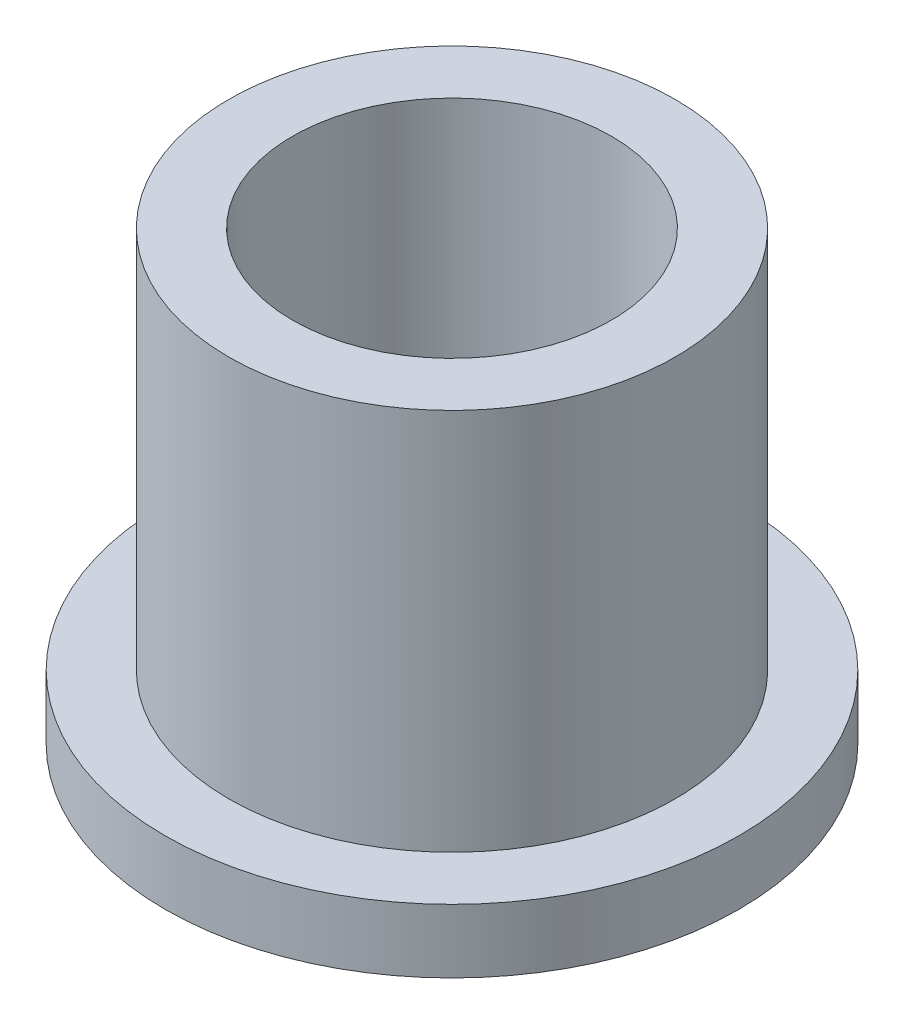
ISO-10303-21;
HEADER;
FILE_DESCRIPTION(('STEP AP214'),'2;1');
FILE_NAME('part.step','',(''),(''),'','','');
FILE_SCHEMA(('AUTOMOTIVE_DESIGN { 1 0 10303 214 1 1 1 1 }'));
ENDSEC;
DATA;
#1=APPLICATION_CONTEXT('core data for automotive mechanical design processes');
#2=APPLICATION_PROTOCOL_DEFINITION('international standard','automotive_design',2000,#1);
#3=PRODUCT_CONTEXT('',#1,'mechanical');
#4=PRODUCT('Part','Part','',(#3));
#5=PRODUCT_RELATED_PRODUCT_CATEGORY('part','',(#4));
#6=PRODUCT_DEFINITION_FORMATION('','',#4);
#7=PRODUCT_DEFINITION_CONTEXT('part definition',#1,'design');
#8=PRODUCT_DEFINITION('design','',#6,#7);
#9=PRODUCT_DEFINITION_SHAPE('','',#8);
#10=(LENGTH_UNIT() NAMED_UNIT(*) SI_UNIT(.MILLI.,.METRE.));
#11=(NAMED_UNIT(*) PLANE_ANGLE_UNIT() SI_UNIT($,.RADIAN.));
#12=(NAMED_UNIT(*) SI_UNIT($,.STERADIAN.) SOLID_ANGLE_UNIT());
#13=UNCERTAINTY_MEASURE_WITH_UNIT(LENGTH_MEASURE(1.E-05),#10,'distance_accuracy_value','');
#14=(GEOMETRIC_REPRESENTATION_CONTEXT(3) GLOBAL_UNCERTAINTY_ASSIGNED_CONTEXT((#13)) GLOBAL_UNIT_ASSIGNED_CONTEXT((#10,
#11,#12)) REPRESENTATION_CONTEXT('',''));
#15=CARTESIAN_POINT('',(0.,0.,0.));
#16=DIRECTION('',(0.,0.,1.));
#17=DIRECTION('',(1.,0.,0.));
#18=AXIS2_PLACEMENT_3D('',#15,#16,#17);
#19=CARTESIAN_POINT('',(0.,11.1125,0.));
#20=DIRECTION('',(0.,1.,0.));
#21=DIRECTION('',(0.,0.,1.));
#22=AXIS2_PLACEMENT_3D('',#19,#20,#21);
#23=PLANE('',#22);
#24=CARTESIAN_POINT('',(0.,11.1125,0.));
#25=DIRECTION('',(0.,1.,0.));
#26=DIRECTION('',(0.,0.,1.));
#27=AXIS2_PLACEMENT_3D('',#24,#25,#26);
#28=CIRCLE('',#27,5.55625);
#29=CARTESIAN_POINT('',(0.,11.1125,5.55625));
#30=VERTEX_POINT('',#29);
#31=EDGE_CURVE('E12',#30,#30,#28,.T.);
#32=ORIENTED_EDGE('',*,*,#31,.T.);
#33=EDGE_LOOP('',(#32));
#34=FACE_BOUND('',#33,.T.);
#35=CARTESIAN_POINT('',(0.,11.1125,0.));
#36=DIRECTION('',(0.,1.,0.));
#37=DIRECTION('',(0.,0.,1.));
#38=AXIS2_PLACEMENT_3D('',#35,#36,#37);
#39=CIRCLE('',#38,3.96875);
#40=CARTESIAN_POINT('',(0.,11.1125,3.96875));
#41=VERTEX_POINT('',#40);
#42=EDGE_CURVE('E51',#41,#41,#39,.T.);
#43=ORIENTED_EDGE('',*,*,#42,.F.);
#44=EDGE_LOOP('',(#43));
#45=FACE_BOUND('',#44,.T.);
#46=ADVANCED_FACE('F44',(#34,#45),#23,.T.);
#47=CARTESIAN_POINT('',(0.,0.,0.));
#48=DIRECTION('',(0.,1.,0.));
#49=DIRECTION('',(0.,0.,1.));
#50=AXIS2_PLACEMENT_3D('',#47,#48,#49);
#51=PLANE('',#50);
#52=CARTESIAN_POINT('',(0.,0.,0.));
#53=DIRECTION('',(0.,1.,0.));
#54=DIRECTION('',(0.,0.,1.));
#55=AXIS2_PLACEMENT_3D('',#52,#53,#54);
#56=CIRCLE('',#55,3.96875);
#57=CARTESIAN_POINT('',(0.,0.,3.96875));
#58=VERTEX_POINT('',#57);
#59=EDGE_CURVE('E55',#58,#58,#56,.T.);
#60=ORIENTED_EDGE('',*,*,#59,.T.);
#61=EDGE_LOOP('',(#60));
#62=FACE_BOUND('',#61,.T.);
#63=CARTESIAN_POINT('',(0.,0.,0.));
#64=DIRECTION('',(0.,1.,0.));
#65=DIRECTION('',(0.,0.,1.));
#66=AXIS2_PLACEMENT_3D('',#63,#64,#65);
#67=CIRCLE('',#66,7.14375);
#68=CARTESIAN_POINT('',(0.,0.,7.14375));
#69=VERTEX_POINT('',#68);
#70=EDGE_CURVE('E62',#69,#69,#67,.T.);
#71=ORIENTED_EDGE('',*,*,#70,.F.);
#72=EDGE_LOOP('',(#71));
#73=FACE_BOUND('',#72,.T.);
#74=ADVANCED_FACE('F87',(#62,#73),#51,.F.);
#75=CARTESIAN_POINT('',(0.,11.1125,0.));
#76=DIRECTION('',(0.,-1.,0.));
#77=DIRECTION('',(0.,0.,-1.));
#78=AXIS2_PLACEMENT_3D('',#75,#76,#77);
#79=CYLINDRICAL_SURFACE('',#78,5.55625);
#80=CARTESIAN_POINT('',(0.,1.5875,0.));
#81=DIRECTION('',(0.,1.,0.));
#82=DIRECTION('',(0.,0.,1.));
#83=AXIS2_PLACEMENT_3D('',#80,#81,#82);
#84=CIRCLE('',#83,5.55625);
#85=CARTESIAN_POINT('',(0.,1.5875,5.55625));
#86=VERTEX_POINT('',#85);
#87=EDGE_CURVE('E65',#86,#86,#84,.T.);
#88=ORIENTED_EDGE('',*,*,#87,.T.);
#89=EDGE_LOOP('',(#88));
#90=FACE_BOUND('',#89,.T.);
#91=ORIENTED_EDGE('',*,*,#31,.F.);
#92=EDGE_LOOP('',(#91));
#93=FACE_BOUND('',#92,.T.);
#94=ADVANCED_FACE('F46',(#90,#93),#79,.T.);
#95=CARTESIAN_POINT('',(0.,11.1125,0.));
#96=DIRECTION('',(0.,-1.,0.));
#97=DIRECTION('',(0.,0.,-1.));
#98=AXIS2_PLACEMENT_3D('',#95,#96,#97);
#99=CYLINDRICAL_SURFACE('',#98,3.96875);
#100=ORIENTED_EDGE('',*,*,#42,.T.);
#101=EDGE_LOOP('',(#100));
#102=FACE_BOUND('',#101,.T.);
#103=ORIENTED_EDGE('',*,*,#59,.F.);
#104=EDGE_LOOP('',(#103));
#105=FACE_BOUND('',#104,.T.);
#106=ADVANCED_FACE('F76',(#102,#105),#99,.F.);
#107=CARTESIAN_POINT('',(0.,1.5875,0.));
#108=DIRECTION('',(0.,1.,0.));
#109=DIRECTION('',(0.,0.,1.));
#110=AXIS2_PLACEMENT_3D('',#107,#108,#109);
#111=PLANE('',#110);
#112=CARTESIAN_POINT('',(0.,1.5875,0.));
#113=DIRECTION('',(0.,1.,0.));
#114=DIRECTION('',(0.,0.,1.));
#115=AXIS2_PLACEMENT_3D('',#112,#113,#114);
#116=CIRCLE('',#115,7.14375);
#117=CARTESIAN_POINT('',(0.,1.5875,7.14375));
#118=VERTEX_POINT('',#117);
#119=EDGE_CURVE('E60',#118,#118,#116,.T.);
#120=ORIENTED_EDGE('',*,*,#119,.T.);
#121=EDGE_LOOP('',(#120));
#122=FACE_BOUND('',#121,.T.);
#123=ORIENTED_EDGE('',*,*,#87,.F.);
#124=EDGE_LOOP('',(#123));
#125=FACE_BOUND('',#124,.T.);
#126=ADVANCED_FACE('F73',(#122,#125),#111,.T.);
#127=CARTESIAN_POINT('',(0.,1.5875,0.));
#128=DIRECTION('',(0.,-1.,0.));
#129=DIRECTION('',(0.,0.,-1.));
#130=AXIS2_PLACEMENT_3D('',#127,#128,#129);
#131=CYLINDRICAL_SURFACE('',#130,7.14375);
#132=ORIENTED_EDGE('',*,*,#119,.F.);
#133=EDGE_LOOP('',(#132));
#134=FACE_BOUND('',#133,.T.);
#135=ORIENTED_EDGE('',*,*,#70,.T.);
#136=EDGE_LOOP('',(#135));
#137=FACE_BOUND('',#136,.T.);
#138=ADVANCED_FACE('F75',(#134,#137),#131,.T.);
#139=CLOSED_SHELL('',(#46,#74,#94,#106,#126,#138));
#140=MANIFOLD_SOLID_BREP('B2',#139);
#141=ADVANCED_BREP_SHAPE_REPRESENTATION('',(#18,#140),#14);
#142=SHAPE_DEFINITION_REPRESENTATION(#9,#141);
ENDSEC;
END-ISO-10303-21;
